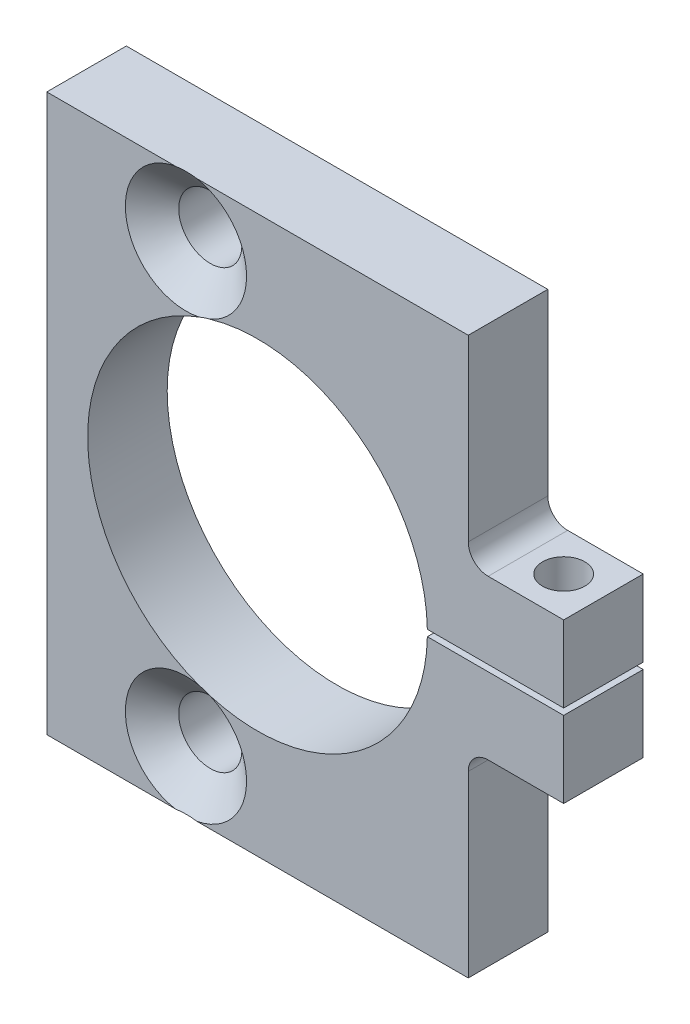
ISO-10303-21;
HEADER;
FILE_DESCRIPTION(('STEP AP214'),'2;1');
FILE_NAME('part.step','',(''),(''),'','','');
FILE_SCHEMA(('AUTOMOTIVE_DESIGN { 1 0 10303 214 1 1 1 1 }'));
ENDSEC;
DATA;
#1=APPLICATION_CONTEXT('core data for automotive mechanical design processes');
#2=APPLICATION_PROTOCOL_DEFINITION('international standard','automotive_design',2000,#1);
#3=PRODUCT_CONTEXT('',#1,'mechanical');
#4=PRODUCT('Part','Part','',(#3));
#5=PRODUCT_RELATED_PRODUCT_CATEGORY('part','',(#4));
#6=PRODUCT_DEFINITION_FORMATION('','',#4);
#7=PRODUCT_DEFINITION_CONTEXT('part definition',#1,'design');
#8=PRODUCT_DEFINITION('design','',#6,#7);
#9=PRODUCT_DEFINITION_SHAPE('','',#8);
#10=(LENGTH_UNIT() NAMED_UNIT(*) SI_UNIT(.MILLI.,.METRE.));
#11=(NAMED_UNIT(*) PLANE_ANGLE_UNIT() SI_UNIT($,.RADIAN.));
#12=(NAMED_UNIT(*) SI_UNIT($,.STERADIAN.) SOLID_ANGLE_UNIT());
#13=UNCERTAINTY_MEASURE_WITH_UNIT(LENGTH_MEASURE(1.E-05),#10,'distance_accuracy_value','');
#14=(GEOMETRIC_REPRESENTATION_CONTEXT(3) GLOBAL_UNCERTAINTY_ASSIGNED_CONTEXT((#13)) GLOBAL_UNIT_ASSIGNED_CONTEXT((#10,
#11,#12)) REPRESENTATION_CONTEXT('',''));
#15=CARTESIAN_POINT('',(0.,0.,0.));
#16=DIRECTION('',(0.,0.,1.));
#17=DIRECTION('',(1.,0.,0.));
#18=AXIS2_PLACEMENT_3D('',#15,#16,#17);
#19=CARTESIAN_POINT('',(41.275,44.45,12.7));
#20=DIRECTION('',(0.,0.,-1.));
#21=DIRECTION('',(-1.,0.,0.));
#22=AXIS2_PLACEMENT_3D('',#19,#20,#21);
#23=PLANE('',#22);
#24=DIRECTION('',(0.,1.,0.));
#25=VECTOR('',#24,1.);
#26=CARTESIAN_POINT('',(26.035,-44.45,12.7));
#27=LINE('',#26,#25);
#28=CARTESIAN_POINT('',(26.035,-44.45,12.7));
#29=VERTEX_POINT('',#28);
#30=CARTESIAN_POINT('',(26.035,-15.875,12.7));
#31=VERTEX_POINT('',#30);
#32=EDGE_CURVE('E169',#29,#31,#27,.T.);
#33=ORIENTED_EDGE('',*,*,#32,.T.);
#34=CARTESIAN_POINT('',(29.21,-15.875,12.7));
#35=DIRECTION('',(0.,0.,-1.));
#36=DIRECTION('',(-1.,0.,0.));
#37=AXIS2_PLACEMENT_3D('',#34,#35,#36);
#38=CIRCLE('',#37,3.175);
#39=CARTESIAN_POINT('',(29.21,-12.7,12.7));
#40=VERTEX_POINT('',#39);
#41=EDGE_CURVE('E347',#31,#40,#38,.T.);
#42=ORIENTED_EDGE('',*,*,#41,.T.);
#43=DIRECTION('',(1.,0.,0.));
#44=VECTOR('',#43,1.);
#45=CARTESIAN_POINT('',(41.275,-12.7,12.7));
#46=LINE('',#45,#44);
#47=CARTESIAN_POINT('',(41.275,-12.7,12.7));
#48=VERTEX_POINT('',#47);
#49=EDGE_CURVE('E346',#40,#48,#46,.T.);
#50=ORIENTED_EDGE('',*,*,#49,.T.);
#51=DIRECTION('',(0.,1.,0.));
#52=VECTOR('',#51,1.);
#53=CARTESIAN_POINT('',(41.275,-44.45,12.7));
#54=LINE('',#53,#52);
#55=CARTESIAN_POINT('',(41.275,-0.508000000000002,12.7));
#56=VERTEX_POINT('',#55);
#57=EDGE_CURVE('E176',#48,#56,#54,.T.);
#58=ORIENTED_EDGE('',*,*,#57,.T.);
#59=DIRECTION('',(1.,0.,0.));
#60=VECTOR('',#59,1.);
#61=CARTESIAN_POINT('',(16.1567832729253,-0.508000000000002,12.7));
#62=LINE('',#61,#60);
#63=CARTESIAN_POINT('',(19.5024430286064,-0.508000000000002,12.7));
#64=VERTEX_POINT('',#63);
#65=EDGE_CURVE('E329',#64,#56,#62,.T.);
#66=ORIENTED_EDGE('',*,*,#65,.F.);
#67=CARTESIAN_POINT('',(-7.62000000000001,0.,12.7));
#68=DIRECTION('',(0.,0.,1.));
#69=DIRECTION('',(1.,0.,0.));
#70=AXIS2_PLACEMENT_3D('',#67,#68,#69);
#71=CIRCLE('',#70,27.1272);
#72=CARTESIAN_POINT('',(-15.198154866507,-26.0471984800522,12.7));
#73=VERTEX_POINT('',#72);
#74=EDGE_CURVE('E322',#73,#64,#71,.T.);
#75=ORIENTED_EDGE('',*,*,#74,.F.);
#76=CARTESIAN_POINT('',(-19.05,-34.925,12.7));
#77=DIRECTION('',(0.,0.,1.));
#78=DIRECTION('',(1.,0.,0.));
#79=AXIS2_PLACEMENT_3D('',#76,#77,#78);
#80=CIRCLE('',#79,9.6774);
#81=CARTESIAN_POINT('',(-17.339314242767,-44.45,12.7));
#82=VERTEX_POINT('',#81);
#83=EDGE_CURVE('E369',#82,#73,#80,.T.);
#84=ORIENTED_EDGE('',*,*,#83,.F.);
#85=DIRECTION('',(1.,0.,0.));
#86=VECTOR('',#85,1.);
#87=CARTESIAN_POINT('',(-41.275,-44.45,12.7));
#88=LINE('',#87,#86);
#89=EDGE_CURVE('E309',#82,#29,#88,.T.);
#90=ORIENTED_EDGE('',*,*,#89,.T.);
#91=EDGE_LOOP('',(#33,#42,#50,#58,#66,#75,#84,#90));
#92=FACE_BOUND('',#91,.T.);
#93=ADVANCED_FACE('F32',(#92),#23,.F.);
#94=CARTESIAN_POINT('',(41.275,-44.45,12.7));
#95=DIRECTION('',(-1.,0.,0.));
#96=DIRECTION('',(0.,0.,1.));
#97=AXIS2_PLACEMENT_3D('',#94,#95,#96);
#98=PLANE('',#97);
#99=DIRECTION('',(0.,0.,1.));
#100=VECTOR('',#99,1.);
#101=CARTESIAN_POINT('',(41.275,-12.7,0.));
#102=LINE('',#101,#100);
#103=CARTESIAN_POINT('',(41.275,-12.7,0.));
#104=VERTEX_POINT('',#103);
#105=EDGE_CURVE('E161',#104,#48,#102,.T.);
#106=ORIENTED_EDGE('',*,*,#105,.F.);
#107=DIRECTION('',(0.,1.,0.));
#108=VECTOR('',#107,1.);
#109=CARTESIAN_POINT('',(41.275,-44.45,0.));
#110=LINE('',#109,#108);
#111=CARTESIAN_POINT('',(41.275,-0.508000000000002,0.));
#112=VERTEX_POINT('',#111);
#113=EDGE_CURVE('E174',#104,#112,#110,.T.);
#114=ORIENTED_EDGE('',*,*,#113,.T.);
#115=DIRECTION('',(0.,0.,1.));
#116=VECTOR('',#115,1.);
#117=CARTESIAN_POINT('',(41.275,-0.508000000000002,12.7));
#118=LINE('',#117,#116);
#119=EDGE_CURVE('E324',#112,#56,#118,.T.);
#120=ORIENTED_EDGE('',*,*,#119,.T.);
#121=ORIENTED_EDGE('',*,*,#57,.F.);
#122=EDGE_LOOP('',(#106,#114,#120,#121));
#123=FACE_BOUND('',#122,.T.);
#124=ADVANCED_FACE('F172',(#123),#98,.F.);
#125=CARTESIAN_POINT('',(-41.275,-44.45,12.7));
#126=DIRECTION('',(0.,1.,0.));
#127=DIRECTION('',(0.,0.,1.));
#128=AXIS2_PLACEMENT_3D('',#125,#126,#127);
#129=PLANE('',#128);
#130=DIRECTION('',(0.,0.,1.));
#131=VECTOR('',#130,1.);
#132=CARTESIAN_POINT('',(26.035,-44.45,0.));
#133=LINE('',#132,#131);
#134=CARTESIAN_POINT('',(26.035,-44.45,0.));
#135=VERTEX_POINT('',#134);
#136=EDGE_CURVE('E177',#135,#29,#133,.T.);
#137=ORIENTED_EDGE('',*,*,#136,.T.);
#138=ORIENTED_EDGE('',*,*,#89,.F.);
#139=CARTESIAN_POINT('',(-37.3789065683908,-44.45,21.9122225883036));
#140=CARTESIAN_POINT('',(-36.9777970751316,-44.45,21.6136081428321));
#141=CARTESIAN_POINT('',(-36.5757182030523,-44.45,21.3162851750371));
#142=CARTESIAN_POINT('',(-35.7691723423192,-44.45,20.7248429279077));
#143=CARTESIAN_POINT('',(-35.3647052008842,-44.45,20.4307238570317));
#144=CARTESIAN_POINT('',(-34.552036967872,-44.45,19.8456662634173));
#145=CARTESIAN_POINT('',(-34.1438293601787,-44.45,19.5547367772536));
#146=CARTESIAN_POINT('',(-33.3240650152779,-44.45,18.9776482350215));
#147=CARTESIAN_POINT('',(-32.9125083558428,-44.45,18.6914890686434));
#148=CARTESIAN_POINT('',(-32.0657165219332,-44.45,18.11163921912));
#149=CARTESIAN_POINT('',(-31.6302844161899,-44.45,17.8182354451884));
#150=CARTESIAN_POINT('',(-30.7539279555369,-44.45,17.2396598245329));
#151=CARTESIAN_POINT('',(-30.31300327215,-44.45,16.9544884735553));
#152=CARTESIAN_POINT('',(-29.4248169839805,-44.45,16.3951131409073));
#153=CARTESIAN_POINT('',(-28.9775618312723,-44.45,16.1208989481246));
#154=CARTESIAN_POINT('',(-28.0747127136943,-44.45,15.586575121114));
#155=CARTESIAN_POINT('',(-27.6191199953543,-44.45,15.3264634011319));
#156=CARTESIAN_POINT('',(-26.9291347800008,-44.45,14.9511892102019));
#157=CARTESIAN_POINT('',(-26.6986310187849,-44.45,14.8288704811586));
#158=CARTESIAN_POINT('',(-26.2347870604906,-44.45,14.5897464441861));
#159=CARTESIAN_POINT('',(-26.0014470191728,-44.45,14.4729408351964));
#160=CARTESIAN_POINT('',(-25.5315073168602,-44.45,14.2456979568016));
#161=CARTESIAN_POINT('',(-25.2949058203959,-44.45,14.1352644712514));
#162=CARTESIAN_POINT('',(-24.8183123695346,-44.45,13.9219486389381));
#163=CARTESIAN_POINT('',(-24.5783204574972,-44.45,13.8190661979319));
#164=CARTESIAN_POINT('',(-24.0974833822219,-44.45,13.6232698676627));
#165=CARTESIAN_POINT('',(-23.8566793421862,-44.45,13.5302554587116));
#166=CARTESIAN_POINT('',(-23.3713836697105,-44.45,13.354292684437));
#167=CARTESIAN_POINT('',(-23.1268918238386,-44.45,13.2713449042525));
#168=CARTESIAN_POINT('',(-22.6345450881543,-44.45,13.1172010893614));
#169=CARTESIAN_POINT('',(-22.3866948153663,-44.45,13.0459904039961));
#170=CARTESIAN_POINT('',(-21.8875875928328,-44.45,12.9168694133885));
#171=CARTESIAN_POINT('',(-21.6363315119804,-44.45,12.8589557809905));
#172=CARTESIAN_POINT('',(-21.165465772855,-44.45,12.7649389939614));
#173=CARTESIAN_POINT('',(-20.9462371463384,-44.45,12.7269346624769));
#174=CARTESIAN_POINT('',(-20.5058095935447,-44.45,12.6628834692872));
#175=CARTESIAN_POINT('',(-20.2846088856311,-44.45,12.6368488438681));
#176=CARTESIAN_POINT('',(-19.738850807055,-44.45,12.5884447246165));
#177=CARTESIAN_POINT('',(-19.4136183919624,-44.45,12.5732874636562));
#178=CARTESIAN_POINT('',(-18.7629724827444,-44.45,12.5710841611875));
#179=CARTESIAN_POINT('',(-18.4375589645166,-44.45,12.5840475836853));
#180=CARTESIAN_POINT('',(-17.7885183469015,-44.45,12.6373464678676));
#181=CARTESIAN_POINT('',(-17.4648946403033,-44.45,12.6777227701142));
#182=CARTESIAN_POINT('',(-16.8218568338894,-44.45,12.7836168356787));
#183=CARTESIAN_POINT('',(-16.5024430838655,-44.45,12.8491366746411));
#184=CARTESIAN_POINT('',(-15.6680633923492,-44.45,13.0507554836747));
#185=CARTESIAN_POINT('',(-15.1575164848272,-44.45,13.205265002259));
#186=CARTESIAN_POINT('',(-14.4036837478423,-44.45,13.4702594151555));
#187=CARTESIAN_POINT('',(-14.1542641883008,-44.45,13.5641928093957));
#188=CARTESIAN_POINT('',(-13.6592099819137,-44.45,13.7615655251344));
#189=CARTESIAN_POINT('',(-13.4135750086328,-44.45,13.8650040213603));
#190=CARTESIAN_POINT('',(-12.9228940548355,-44.45,14.0812887570081));
#191=CARTESIAN_POINT('',(-12.677892588514,-44.45,14.1942351735886));
#192=CARTESIAN_POINT('',(-12.1912632266391,-44.45,14.4271656175662));
#193=CARTESIAN_POINT('',(-11.9496353765326,-44.45,14.547149739657));
#194=CARTESIAN_POINT('',(-11.4695626594991,-44.45,14.793043474119));
#195=CARTESIAN_POINT('',(-11.2311163945184,-44.45,14.9189503659205));
#196=CARTESIAN_POINT('',(-10.7570045780567,-44.45,15.1758562240116));
#197=CARTESIAN_POINT('',(-10.5213388984705,-44.45,15.30685495451));
#198=CARTESIAN_POINT('',(-9.99314671211864,-44.45,15.6069300567459));
#199=CARTESIAN_POINT('',(-9.70132799793763,-44.45,15.777250968638));
#200=CARTESIAN_POINT('',(-9.12107412748869,-44.45,16.1235745750786));
#201=CARTESIAN_POINT('',(-8.83263913188913,-44.45,16.2995775379497));
#202=CARTESIAN_POINT('',(-8.25866696031576,-44.45,16.6563587652643));
#203=CARTESIAN_POINT('',(-7.9731303452732,-44.45,16.8371379305564));
#204=CARTESIAN_POINT('',(-7.40462675685224,-44.45,17.2026971333723));
#205=CARTESIAN_POINT('',(-7.12165983715768,-44.45,17.3874772542088));
#206=CARTESIAN_POINT('',(-6.27568135724283,-44.45,17.947162812062));
#207=CARTESIAN_POINT('',(-5.71602532175118,-44.45,18.3271415066067));
#208=CARTESIAN_POINT('',(-4.60364642423927,-44.45,19.0969492871714));
#209=CARTESIAN_POINT('',(-4.05092290644836,-44.45,19.4867774308207));
#210=CARTESIAN_POINT('',(-2.94911636600263,-44.45,20.2751460685569));
#211=CARTESIAN_POINT('',(-2.40005015089908,-44.45,20.6737100112717));
#212=CARTESIAN_POINT('',(-1.3061740270668,-44.45,21.4766481601603));
#213=CARTESIAN_POINT('',(-0.761364206019786,-44.45,21.8810224855435));
#214=CARTESIAN_POINT('',(0.324590110640036,-44.45,22.6941530540228));
#215=CARTESIAN_POINT('',(0.865736140748539,-44.45,23.1029072502087));
#216=CARTESIAN_POINT('',(1.94524232055058,-44.45,23.9240658806977));
#217=CARTESIAN_POINT('',(2.48360249017921,-44.45,24.3364702888231));
#218=CARTESIAN_POINT('',(3.97057820624369,-44.45,25.4820442771918));
#219=CARTESIAN_POINT('',(4.91677740578392,-44.45,26.2183494667041));
#220=CARTESIAN_POINT('',(6.80415094930307,-44.45,27.6976109581132));
#221=CARTESIAN_POINT('',(7.74532461824586,-44.45,28.4405681193342));
#222=CARTESIAN_POINT('',(9.61826568990615,-44.45,29.9269393962963));
#223=CARTESIAN_POINT('',(10.5500558166197,-44.45,30.6703248956648));
#224=CARTESIAN_POINT('',(11.9454719689629,-44.45,31.7880879066351));
#225=CARTESIAN_POINT('',(12.4101973791179,-44.45,32.1610946663902));
#226=CARTESIAN_POINT('',(13.3389959089699,-44.45,32.9079180281409));
#227=CARTESIAN_POINT('',(13.8030690296602,-44.45,33.281734628901));
#228=CARTESIAN_POINT('',(14.2668568821521,-44.45,33.6559049075208));
#229=B_SPLINE_CURVE_WITH_KNOTS('',3,(#139,#140,#141,#142,#143,#144,#145,#146,#147,#148,#149,
#150,#151,#152,#153,#154,#155,#156,#157,#158,#159,#160,#161,#162,#163,#164,#165,#166,#167,#168,
#169,#170,#171,#172,#173,#174,#175,#176,#177,#178,#179,#180,#181,#182,#183,#184,#185,#186,#187,
#188,#189,#190,#191,#192,#193,#194,#195,#196,#197,#198,#199,#200,#201,#202,#203,#204,#205,#206,
#207,#208,#209,#210,#211,#212,#213,#214,#215,#216,#217,#218,#219,#220,#221,#222,#223,#224,#225,
#226,#227,#228),.UNSPECIFIED.,.F.,.F.,(4,2,2,2,2,2,2,2,2,2,2,2,2,2,2,2,2,2,2,2,2,2,2,2,2,2,2,2,
2,2,2,2,2,2,2,2,2,2,2,2,2,2,2,2,4),(0.,1.50018508266125,3.0004671972828,4.50425457600885,
6.00800713250039,7.58311210459572,9.158311730562,10.7320074401641,12.3054697618331,
13.0882550462338,13.870997534725,14.6542001418307,15.437392972273,16.2116318306802,
16.9859156714355,17.7592255816378,18.532341784762,19.1995251441862,19.8673890377,
20.8428895443382,21.8187184062641,22.7960042879146,23.7733708636462,25.3704291403291,
26.1698778860053,26.9692572856691,27.7784819985516,28.5877176022014,29.3965850529847,
30.2054150915161,31.2189939035156,32.2326206498304,33.2464399626525,34.2602804068025,
36.2894954034371,38.3185169796029,40.3538887716179,42.3893023823151,44.4238029902121,
46.4582890194212,50.0550392329909,53.652260990764,57.2282365312682,59.0159533495095,
60.8036674422629),.UNSPECIFIED.);
#230=CARTESIAN_POINT('',(-20.760685757233,-44.45,12.7));
#231=VERTEX_POINT('',#230);
#232=EDGE_CURVE('E377',#82,#231,#229,.F.);
#233=ORIENTED_EDGE('',*,*,#232,.T.);
#234=CARTESIAN_POINT('',(-41.275,-44.45,12.7));
#235=VERTEX_POINT('',#234);
#236=EDGE_CURVE('E191',#235,#231,#88,.T.);
#237=ORIENTED_EDGE('',*,*,#236,.F.);
#238=DIRECTION('',(0.,0.,-1.));
#239=VECTOR('',#238,1.);
#240=CARTESIAN_POINT('',(-41.275,-44.45,12.7));
#241=LINE('',#240,#239);
#242=CARTESIAN_POINT('',(-41.275,-44.45,0.));
#243=VERTEX_POINT('',#242);
#244=EDGE_CURVE('E199',#235,#243,#241,.T.);
#245=ORIENTED_EDGE('',*,*,#244,.T.);
#246=DIRECTION('',(1.,0.,0.));
#247=VECTOR('',#246,1.);
#248=CARTESIAN_POINT('',(-41.275,-44.45,0.));
#249=LINE('',#248,#247);
#250=EDGE_CURVE('E195',#243,#135,#249,.T.);
#251=ORIENTED_EDGE('',*,*,#250,.T.);
#252=EDGE_LOOP('',(#137,#138,#233,#237,#245,#251));
#253=FACE_BOUND('',#252,.T.);
#254=ADVANCED_FACE('F284',(#253),#129,.F.);
#255=CARTESIAN_POINT('',(41.275,44.45,0.));
#256=DIRECTION('',(0.,0.,-1.));
#257=DIRECTION('',(-1.,0.,0.));
#258=AXIS2_PLACEMENT_3D('',#255,#256,#257);
#259=PLANE('',#258);
#260=CARTESIAN_POINT('',(-19.05,34.925,0.));
#261=DIRECTION('',(0.,0.,-1.));
#262=DIRECTION('',(-1.,0.,0.));
#263=AXIS2_PLACEMENT_3D('',#260,#261,#262);
#264=CIRCLE('',#263,2.92826505741483);
#265=CARTESIAN_POINT('',(-21.9782650574148,34.925,0.));
#266=VERTEX_POINT('',#265);
#267=EDGE_CURVE('E216',#266,#266,#264,.T.);
#268=ORIENTED_EDGE('',*,*,#267,.F.);
#269=EDGE_LOOP('',(#268));
#270=FACE_BOUND('',#269,.T.);
#271=CARTESIAN_POINT('',(-19.05,-34.925,0.));
#272=DIRECTION('',(0.,0.,-1.));
#273=DIRECTION('',(-1.,0.,0.));
#274=AXIS2_PLACEMENT_3D('',#271,#272,#273);
#275=CIRCLE('',#274,2.92826505741483);
#276=CARTESIAN_POINT('',(-21.9782650574148,-34.925,0.));
#277=VERTEX_POINT('',#276);
#278=EDGE_CURVE('E383',#277,#277,#275,.T.);
#279=ORIENTED_EDGE('',*,*,#278,.F.);
#280=EDGE_LOOP('',(#279));
#281=FACE_BOUND('',#280,.T.);
#282=DIRECTION('',(1.,0.,0.));
#283=VECTOR('',#282,1.);
#284=CARTESIAN_POINT('',(41.275,-12.7,0.));
#285=LINE('',#284,#283);
#286=CARTESIAN_POINT('',(29.21,-12.7,0.));
#287=VERTEX_POINT('',#286);
#288=EDGE_CURVE('E156',#287,#104,#285,.T.);
#289=ORIENTED_EDGE('',*,*,#288,.F.);
#290=CARTESIAN_POINT('',(29.21,-15.875,0.));
#291=DIRECTION('',(0.,0.,-1.));
#292=DIRECTION('',(-1.,0.,0.));
#293=AXIS2_PLACEMENT_3D('',#290,#291,#292);
#294=CIRCLE('',#293,3.175);
#295=CARTESIAN_POINT('',(26.035,-15.875,0.));
#296=VERTEX_POINT('',#295);
#297=EDGE_CURVE('E423',#287,#296,#294,.F.);
#298=ORIENTED_EDGE('',*,*,#297,.T.);
#299=DIRECTION('',(0.,1.,0.));
#300=VECTOR('',#299,1.);
#301=CARTESIAN_POINT('',(26.035,-44.45,0.));
#302=LINE('',#301,#300);
#303=EDGE_CURVE('E168',#135,#296,#302,.T.);
#304=ORIENTED_EDGE('',*,*,#303,.F.);
#305=ORIENTED_EDGE('',*,*,#250,.F.);
#306=DIRECTION('',(0.,-1.,0.));
#307=VECTOR('',#306,1.);
#308=CARTESIAN_POINT('',(-41.275,-44.45,0.));
#309=LINE('',#308,#307);
#310=CARTESIAN_POINT('',(-41.275,44.45,0.));
#311=VERTEX_POINT('',#310);
#312=EDGE_CURVE('E186',#311,#243,#309,.T.);
#313=ORIENTED_EDGE('',*,*,#312,.F.);
#314=DIRECTION('',(-1.,0.,0.));
#315=VECTOR('',#314,1.);
#316=CARTESIAN_POINT('',(-41.275,44.45,0.));
#317=LINE('',#316,#315);
#318=CARTESIAN_POINT('',(26.035,44.45,0.));
#319=VERTEX_POINT('',#318);
#320=EDGE_CURVE('E183',#319,#311,#317,.T.);
#321=ORIENTED_EDGE('',*,*,#320,.F.);
#322=DIRECTION('',(0.,-1.,0.));
#323=VECTOR('',#322,1.);
#324=CARTESIAN_POINT('',(26.035,44.45,0.));
#325=LINE('',#324,#323);
#326=CARTESIAN_POINT('',(26.035,15.875,0.));
#327=VERTEX_POINT('',#326);
#328=EDGE_CURVE('E355',#319,#327,#325,.T.);
#329=ORIENTED_EDGE('',*,*,#328,.T.);
#330=CARTESIAN_POINT('',(29.21,15.875,0.));
#331=DIRECTION('',(0.,0.,-1.));
#332=DIRECTION('',(-1.,0.,0.));
#333=AXIS2_PLACEMENT_3D('',#330,#331,#332);
#334=CIRCLE('',#333,3.175);
#335=CARTESIAN_POINT('',(29.21,12.7,0.));
#336=VERTEX_POINT('',#335);
#337=EDGE_CURVE('E11',#327,#336,#334,.F.);
#338=ORIENTED_EDGE('',*,*,#337,.T.);
#339=DIRECTION('',(1.,0.,0.));
#340=VECTOR('',#339,1.);
#341=CARTESIAN_POINT('',(41.275,12.7,0.));
#342=LINE('',#341,#340);
#343=CARTESIAN_POINT('',(41.275,12.7,0.));
#344=VERTEX_POINT('',#343);
#345=EDGE_CURVE('E357',#336,#344,#342,.T.);
#346=ORIENTED_EDGE('',*,*,#345,.T.);
#347=CARTESIAN_POINT('',(41.275,0.507999999999998,0.));
#348=VERTEX_POINT('',#347);
#349=EDGE_CURVE('E184',#348,#344,#110,.T.);
#350=ORIENTED_EDGE('',*,*,#349,.F.);
#351=DIRECTION('',(-1.,0.,0.));
#352=VECTOR('',#351,1.);
#353=CARTESIAN_POINT('',(16.1567832729253,0.507999999999998,0.));
#354=LINE('',#353,#352);
#355=CARTESIAN_POINT('',(19.5024430286064,0.507999999999998,0.));
#356=VERTEX_POINT('',#355);
#357=EDGE_CURVE('E332',#348,#356,#354,.T.);
#358=ORIENTED_EDGE('',*,*,#357,.T.);
#359=CARTESIAN_POINT('',(-7.62000000000001,0.,0.));
#360=DIRECTION('',(0.,0.,1.));
#361=DIRECTION('',(1.,0.,0.));
#362=AXIS2_PLACEMENT_3D('',#359,#360,#361);
#363=CIRCLE('',#362,27.1272);
#364=CARTESIAN_POINT('',(19.5024430286064,-0.508000000000002,0.));
#365=VERTEX_POINT('',#364);
#366=EDGE_CURVE('E189',#356,#365,#363,.T.);
#367=ORIENTED_EDGE('',*,*,#366,.T.);
#368=DIRECTION('',(1.,0.,0.));
#369=VECTOR('',#368,1.);
#370=CARTESIAN_POINT('',(16.1567832729253,-0.508000000000002,0.));
#371=LINE('',#370,#369);
#372=EDGE_CURVE('E182',#365,#112,#371,.T.);
#373=ORIENTED_EDGE('',*,*,#372,.T.);
#374=ORIENTED_EDGE('',*,*,#113,.F.);
#375=EDGE_LOOP('',(#289,#298,#304,#305,#313,#321,#329,#338,#346,#350,#358,#367,#373,#374));
#376=FACE_BOUND('',#375,.T.);
#377=ADVANCED_FACE('F180',(#270,#281,#376),#259,.T.);
#378=CARTESIAN_POINT('',(34.925,44.45,6.35));
#379=DIRECTION('',(0.,1.,0.));
#380=DIRECTION('',(0.,0.,1.));
#381=AXIS2_PLACEMENT_3D('',#378,#379,#380);
#382=CYLINDRICAL_SURFACE('',#381,3.37819999999998);
#383=CARTESIAN_POINT('',(34.925,-0.508000000000002,6.35));
#384=DIRECTION('',(0.,-1.,0.));
#385=DIRECTION('',(0.,0.,-1.));
#386=AXIS2_PLACEMENT_3D('',#383,#384,#385);
#387=CIRCLE('',#386,3.37819999999998);
#388=CARTESIAN_POINT('',(34.925,-0.508000000000002,2.97180000000002));
#389=VERTEX_POINT('',#388);
#390=EDGE_CURVE('E212',#389,#389,#387,.T.);
#391=ORIENTED_EDGE('',*,*,#390,.F.);
#392=EDGE_LOOP('',(#391));
#393=FACE_BOUND('',#392,.T.);
#394=CARTESIAN_POINT('',(34.925,-12.7,6.35));
#395=DIRECTION('',(0.,-1.,0.));
#396=DIRECTION('',(1.,0.,0.));
#397=AXIS2_PLACEMENT_3D('',#394,#395,#396);
#398=CIRCLE('',#397,3.37819999999998);
#399=CARTESIAN_POINT('',(38.3032,-12.7,6.35));
#400=VERTEX_POINT('',#399);
#401=EDGE_CURVE('E353',#400,#400,#398,.F.);
#402=ORIENTED_EDGE('',*,*,#401,.F.);
#403=EDGE_LOOP('',(#402));
#404=FACE_BOUND('',#403,.T.);
#405=ADVANCED_FACE('F288',(#393,#404),#382,.F.);
#406=CARTESIAN_POINT('',(41.275,0.507999999999998,12.7));
#407=VERTEX_POINT('',#406);
#408=CARTESIAN_POINT('',(41.275,12.7,12.7));
#409=VERTEX_POINT('',#408);
#410=EDGE_CURVE('E198',#407,#409,#54,.T.);
#411=ORIENTED_EDGE('',*,*,#410,.T.);
#412=DIRECTION('',(1.,0.,0.));
#413=VECTOR('',#412,1.);
#414=CARTESIAN_POINT('',(41.275,12.7,12.7));
#415=LINE('',#414,#413);
#416=CARTESIAN_POINT('',(29.21,12.7,12.7));
#417=VERTEX_POINT('',#416);
#418=EDGE_CURVE('E358',#417,#409,#415,.T.);
#419=ORIENTED_EDGE('',*,*,#418,.F.);
#420=CARTESIAN_POINT('',(29.21,15.875,12.7));
#421=DIRECTION('',(0.,0.,-1.));
#422=DIRECTION('',(-1.,0.,0.));
#423=AXIS2_PLACEMENT_3D('',#420,#421,#422);
#424=CIRCLE('',#423,3.175);
#425=CARTESIAN_POINT('',(26.035,15.875,12.7));
#426=VERTEX_POINT('',#425);
#427=EDGE_CURVE('E40',#417,#426,#424,.T.);
#428=ORIENTED_EDGE('',*,*,#427,.T.);
#429=DIRECTION('',(0.,-1.,0.));
#430=VECTOR('',#429,1.);
#431=CARTESIAN_POINT('',(26.035,44.45,12.7));
#432=LINE('',#431,#430);
#433=CARTESIAN_POINT('',(26.035,44.45,12.7));
#434=VERTEX_POINT('',#433);
#435=EDGE_CURVE('E361',#434,#426,#432,.T.);
#436=ORIENTED_EDGE('',*,*,#435,.F.);
#437=DIRECTION('',(-1.,0.,0.));
#438=VECTOR('',#437,1.);
#439=CARTESIAN_POINT('',(-41.275,44.45,12.7));
#440=LINE('',#439,#438);
#441=CARTESIAN_POINT('',(-17.339314242767,44.45,12.7));
#442=VERTEX_POINT('',#441);
#443=EDGE_CURVE('E313',#434,#442,#440,.T.);
#444=ORIENTED_EDGE('',*,*,#443,.T.);
#445=CARTESIAN_POINT('',(-19.05,34.925,12.7));
#446=DIRECTION('',(0.,0.,1.));
#447=DIRECTION('',(1.,0.,0.));
#448=AXIS2_PLACEMENT_3D('',#445,#446,#447);
#449=CIRCLE('',#448,9.6774);
#450=CARTESIAN_POINT('',(-15.1981548665071,26.0471984800522,12.7));
#451=VERTEX_POINT('',#450);
#452=EDGE_CURVE('E384',#451,#442,#449,.T.);
#453=ORIENTED_EDGE('',*,*,#452,.F.);
#454=CARTESIAN_POINT('',(19.5024430286064,0.507999999999998,12.7));
#455=VERTEX_POINT('',#454);
#456=EDGE_CURVE('E318',#455,#451,#71,.T.);
#457=ORIENTED_EDGE('',*,*,#456,.F.);
#458=DIRECTION('',(-1.,0.,0.));
#459=VECTOR('',#458,1.);
#460=CARTESIAN_POINT('',(16.1567832729253,0.507999999999998,12.7));
#461=LINE('',#460,#459);
#462=EDGE_CURVE('E333',#407,#455,#461,.T.);
#463=ORIENTED_EDGE('',*,*,#462,.F.);
#464=EDGE_LOOP('',(#411,#419,#428,#436,#444,#453,#457,#463));
#465=FACE_BOUND('',#464,.T.);
#466=ADVANCED_FACE('F265',(#465),#23,.F.);
#467=ORIENTED_EDGE('',*,*,#349,.T.);
#468=DIRECTION('',(0.,0.,1.));
#469=VECTOR('',#468,1.);
#470=CARTESIAN_POINT('',(41.275,12.7,0.));
#471=LINE('',#470,#469);
#472=EDGE_CURVE('E364',#344,#409,#471,.T.);
#473=ORIENTED_EDGE('',*,*,#472,.T.);
#474=ORIENTED_EDGE('',*,*,#410,.F.);
#475=DIRECTION('',(0.,0.,-1.));
#476=VECTOR('',#475,1.);
#477=CARTESIAN_POINT('',(41.275,0.508000000000002,12.7));
#478=LINE('',#477,#476);
#479=EDGE_CURVE('E326',#407,#348,#478,.T.);
#480=ORIENTED_EDGE('',*,*,#479,.T.);
#481=EDGE_LOOP('',(#467,#473,#474,#480));
#482=FACE_BOUND('',#481,.T.);
#483=ADVANCED_FACE('F261',(#482),#98,.F.);
#484=CARTESIAN_POINT('',(-41.275,44.45,12.7));
#485=DIRECTION('',(0.,-1.,0.));
#486=DIRECTION('',(0.,0.,-1.));
#487=AXIS2_PLACEMENT_3D('',#484,#485,#486);
#488=PLANE('',#487);
#489=ORIENTED_EDGE('',*,*,#443,.F.);
#490=DIRECTION('',(0.,0.,1.));
#491=VECTOR('',#490,1.);
#492=CARTESIAN_POINT('',(26.035,44.45,0.));
#493=LINE('',#492,#491);
#494=EDGE_CURVE('E360',#319,#434,#493,.T.);
#495=ORIENTED_EDGE('',*,*,#494,.F.);
#496=ORIENTED_EDGE('',*,*,#320,.T.);
#497=DIRECTION('',(0.,0.,-1.));
#498=VECTOR('',#497,1.);
#499=CARTESIAN_POINT('',(-41.275,44.45,12.7));
#500=LINE('',#499,#498);
#501=CARTESIAN_POINT('',(-41.275,44.45,12.7));
#502=VERTEX_POINT('',#501);
#503=EDGE_CURVE('E202',#502,#311,#500,.T.);
#504=ORIENTED_EDGE('',*,*,#503,.F.);
#505=CARTESIAN_POINT('',(-20.760685757233,44.45,12.7));
#506=VERTEX_POINT('',#505);
#507=EDGE_CURVE('E314',#506,#502,#440,.T.);
#508=ORIENTED_EDGE('',*,*,#507,.F.);
#509=CARTESIAN_POINT('',(-37.3789065683908,44.45,21.9122225883036));
#510=CARTESIAN_POINT('',(-36.9777970751316,44.45,21.6136081428321));
#511=CARTESIAN_POINT('',(-36.5757182030523,44.45,21.3162851750371));
#512=CARTESIAN_POINT('',(-35.7691723423192,44.45,20.7248429279077));
#513=CARTESIAN_POINT('',(-35.3647052008842,44.45,20.4307238570317));
#514=CARTESIAN_POINT('',(-34.552036967872,44.45,19.8456662634173));
#515=CARTESIAN_POINT('',(-34.1438293601787,44.45,19.5547367772536));
#516=CARTESIAN_POINT('',(-33.3240650152779,44.45,18.9776482350215));
#517=CARTESIAN_POINT('',(-32.9125083558428,44.45,18.6914890686434));
#518=CARTESIAN_POINT('',(-32.0657165219332,44.45,18.11163921912));
#519=CARTESIAN_POINT('',(-31.6302844161899,44.45,17.8182354451884));
#520=CARTESIAN_POINT('',(-30.7539279555369,44.45,17.2396598245329));
#521=CARTESIAN_POINT('',(-30.31300327215,44.45,16.9544884735553));
#522=CARTESIAN_POINT('',(-29.4248169839805,44.45,16.3951131409073));
#523=CARTESIAN_POINT('',(-28.9775618312723,44.45,16.1208989481246));
#524=CARTESIAN_POINT('',(-28.0747127136943,44.45,15.586575121114));
#525=CARTESIAN_POINT('',(-27.6191199953543,44.45,15.3264634011319));
#526=CARTESIAN_POINT('',(-26.9291347800008,44.45,14.9511892102019));
#527=CARTESIAN_POINT('',(-26.6986310187849,44.45,14.8288704811586));
#528=CARTESIAN_POINT('',(-26.2347870604906,44.45,14.5897464441861));
#529=CARTESIAN_POINT('',(-26.0014470191728,44.45,14.4729408351964));
#530=CARTESIAN_POINT('',(-25.5315073168602,44.45,14.2456979568016));
#531=CARTESIAN_POINT('',(-25.2949058203959,44.45,14.1352644712514));
#532=CARTESIAN_POINT('',(-24.8183123695346,44.45,13.9219486389381));
#533=CARTESIAN_POINT('',(-24.5783204574972,44.45,13.8190661979319));
#534=CARTESIAN_POINT('',(-24.0974833822219,44.45,13.6232698676627));
#535=CARTESIAN_POINT('',(-23.8566793421862,44.45,13.5302554587116));
#536=CARTESIAN_POINT('',(-23.3713836697105,44.45,13.354292684437));
#537=CARTESIAN_POINT('',(-23.1268918238386,44.45,13.2713449042525));
#538=CARTESIAN_POINT('',(-22.6345450881543,44.45,13.1172010893614));
#539=CARTESIAN_POINT('',(-22.3866948153663,44.45,13.0459904039961));
#540=CARTESIAN_POINT('',(-21.8875875928328,44.45,12.9168694133885));
#541=CARTESIAN_POINT('',(-21.6363315119804,44.45,12.8589557809905));
#542=CARTESIAN_POINT('',(-21.165465772855,44.45,12.7649389939614));
#543=CARTESIAN_POINT('',(-20.9462371463384,44.45,12.7269346624769));
#544=CARTESIAN_POINT('',(-20.5058095935447,44.45,12.6628834692872));
#545=CARTESIAN_POINT('',(-20.2846088856311,44.45,12.6368488438681));
#546=CARTESIAN_POINT('',(-19.738850807055,44.45,12.5884447246165));
#547=CARTESIAN_POINT('',(-19.4136183919624,44.45,12.5732874636562));
#548=CARTESIAN_POINT('',(-18.7629724827444,44.45,12.5710841611875));
#549=CARTESIAN_POINT('',(-18.4375589645166,44.45,12.5840475836853));
#550=CARTESIAN_POINT('',(-17.7885183469015,44.45,12.6373464678676));
#551=CARTESIAN_POINT('',(-17.4648946403033,44.45,12.6777227701142));
#552=CARTESIAN_POINT('',(-16.8218568338894,44.45,12.7836168356787));
#553=CARTESIAN_POINT('',(-16.5024430838655,44.45,12.8491366746411));
#554=CARTESIAN_POINT('',(-15.6680633923492,44.45,13.0507554836747));
#555=CARTESIAN_POINT('',(-15.1575164848272,44.45,13.205265002259));
#556=CARTESIAN_POINT('',(-14.4036837478423,44.45,13.4702594151555));
#557=CARTESIAN_POINT('',(-14.1542641883008,44.45,13.5641928093957));
#558=CARTESIAN_POINT('',(-13.6592099819137,44.45,13.7615655251344));
#559=CARTESIAN_POINT('',(-13.4135750086328,44.45,13.8650040213603));
#560=CARTESIAN_POINT('',(-12.9228940548355,44.45,14.0812887570081));
#561=CARTESIAN_POINT('',(-12.677892588514,44.45,14.1942351735886));
#562=CARTESIAN_POINT('',(-12.1912632266391,44.45,14.4271656175662));
#563=CARTESIAN_POINT('',(-11.9496353765326,44.45,14.547149739657));
#564=CARTESIAN_POINT('',(-11.4695626594991,44.45,14.793043474119));
#565=CARTESIAN_POINT('',(-11.2311163945184,44.45,14.9189503659205));
#566=CARTESIAN_POINT('',(-10.7570045780567,44.45,15.1758562240116));
#567=CARTESIAN_POINT('',(-10.5213388984705,44.45,15.30685495451));
#568=CARTESIAN_POINT('',(-9.99314671211864,44.45,15.6069300567459));
#569=CARTESIAN_POINT('',(-9.70132799793763,44.45,15.777250968638));
#570=CARTESIAN_POINT('',(-9.12107412748869,44.45,16.1235745750786));
#571=CARTESIAN_POINT('',(-8.83263913188913,44.45,16.2995775379497));
#572=CARTESIAN_POINT('',(-8.25866696031576,44.45,16.6563587652643));
#573=CARTESIAN_POINT('',(-7.9731303452732,44.45,16.8371379305564));
#574=CARTESIAN_POINT('',(-7.40462675685224,44.45,17.2026971333723));
#575=CARTESIAN_POINT('',(-7.12165983715768,44.45,17.3874772542088));
#576=CARTESIAN_POINT('',(-6.27568135724283,44.45,17.947162812062));
#577=CARTESIAN_POINT('',(-5.71602532175118,44.45,18.3271415066067));
#578=CARTESIAN_POINT('',(-4.60364642423927,44.45,19.0969492871714));
#579=CARTESIAN_POINT('',(-4.05092290644836,44.45,19.4867774308207));
#580=CARTESIAN_POINT('',(-2.94911636600263,44.45,20.2751460685569));
#581=CARTESIAN_POINT('',(-2.40005015089908,44.45,20.6737100112717));
#582=CARTESIAN_POINT('',(-1.3061740270668,44.45,21.4766481601603));
#583=CARTESIAN_POINT('',(-0.761364206019786,44.45,21.8810224855435));
#584=CARTESIAN_POINT('',(0.324590110640036,44.45,22.6941530540228));
#585=CARTESIAN_POINT('',(0.865736140748539,44.45,23.1029072502087));
#586=CARTESIAN_POINT('',(1.94524232055058,44.45,23.9240658806977));
#587=CARTESIAN_POINT('',(2.48360249017921,44.45,24.3364702888231));
#588=CARTESIAN_POINT('',(3.97057820624369,44.45,25.4820442771918));
#589=CARTESIAN_POINT('',(4.91677740578392,44.45,26.2183494667041));
#590=CARTESIAN_POINT('',(6.80415094930307,44.45,27.6976109581132));
#591=CARTESIAN_POINT('',(7.74532461824586,44.45,28.4405681193342));
#592=CARTESIAN_POINT('',(9.61826568990615,44.45,29.9269393962963));
#593=CARTESIAN_POINT('',(10.5500558166197,44.45,30.6703248956648));
#594=CARTESIAN_POINT('',(11.9454719689629,44.45,31.7880879066351));
#595=CARTESIAN_POINT('',(12.4101973791179,44.45,32.1610946663902));
#596=CARTESIAN_POINT('',(13.3389959089699,44.45,32.9079180281409));
#597=CARTESIAN_POINT('',(13.8030690296602,44.45,33.281734628901));
#598=CARTESIAN_POINT('',(14.2668568821521,44.45,33.6559049075208));
#599=B_SPLINE_CURVE_WITH_KNOTS('',3,(#509,#510,#511,#512,#513,#514,#515,#516,#517,#518,#519,
#520,#521,#522,#523,#524,#525,#526,#527,#528,#529,#530,#531,#532,#533,#534,#535,#536,#537,#538,
#539,#540,#541,#542,#543,#544,#545,#546,#547,#548,#549,#550,#551,#552,#553,#554,#555,#556,#557,
#558,#559,#560,#561,#562,#563,#564,#565,#566,#567,#568,#569,#570,#571,#572,#573,#574,#575,#576,
#577,#578,#579,#580,#581,#582,#583,#584,#585,#586,#587,#588,#589,#590,#591,#592,#593,#594,#595,
#596,#597,#598),.UNSPECIFIED.,.F.,.F.,(4,2,2,2,2,2,2,2,2,2,2,2,2,2,2,2,2,2,2,2,2,2,2,2,2,2,2,2,
2,2,2,2,2,2,2,2,2,2,2,2,2,2,2,2,4),(0.,1.50018508266125,3.0004671972828,4.50425457600885,
6.00800713250039,7.58311210459572,9.158311730562,10.7320074401641,12.3054697618331,
13.0882550462338,13.870997534725,14.6542001418307,15.437392972273,16.2116318306802,
16.9859156714355,17.7592255816378,18.532341784762,19.1995251441862,19.8673890377,
20.8428895443382,21.8187184062641,22.7960042879146,23.7733708636462,25.3704291403291,
26.1698778860053,26.9692572856691,27.7784819985516,28.5877176022014,29.3965850529847,
30.2054150915161,31.2189939035156,32.2326206498304,33.2464399626525,34.2602804068025,
36.2894954034371,38.3185169796029,40.3538887716179,42.3893023823151,44.4238029902121,
46.4582890194212,50.0550392329909,53.652260990764,57.2282365312682,59.0159533495095,
60.8036674422629),.UNSPECIFIED.);
#600=EDGE_CURVE('E244',#506,#442,#599,.T.);
#601=ORIENTED_EDGE('',*,*,#600,.T.);
#602=EDGE_LOOP('',(#489,#495,#496,#504,#508,#601));
#603=FACE_BOUND('',#602,.T.);
#604=ADVANCED_FACE('F255',(#603),#488,.F.);
#605=CARTESIAN_POINT('',(-41.275,-44.45,12.7));
#606=DIRECTION('',(1.,0.,0.));
#607=DIRECTION('',(0.,0.,-1.));
#608=AXIS2_PLACEMENT_3D('',#605,#606,#607);
#609=PLANE('',#608);
#610=ORIENTED_EDGE('',*,*,#312,.T.);
#611=ORIENTED_EDGE('',*,*,#244,.F.);
#612=DIRECTION('',(0.,-1.,0.));
#613=VECTOR('',#612,1.);
#614=CARTESIAN_POINT('',(-41.275,-44.45,12.7));
#615=LINE('',#614,#613);
#616=EDGE_CURVE('E305',#502,#235,#615,.T.);
#617=ORIENTED_EDGE('',*,*,#616,.F.);
#618=ORIENTED_EDGE('',*,*,#503,.T.);
#619=EDGE_LOOP('',(#610,#611,#617,#618));
#620=FACE_BOUND('',#619,.T.);
#621=ADVANCED_FACE('F260',(#620),#609,.F.);
#622=ORIENTED_EDGE('',*,*,#236,.T.);
#623=CARTESIAN_POINT('',(-16.9078043284765,-25.4876768379531,12.7));
#624=VERTEX_POINT('',#623);
#625=EDGE_CURVE('E302',#624,#231,#80,.T.);
#626=ORIENTED_EDGE('',*,*,#625,.F.);
#627=CARTESIAN_POINT('',(-16.9078043284766,25.4876768379531,12.7));
#628=VERTEX_POINT('',#627);
#629=EDGE_CURVE('E321',#628,#624,#71,.T.);
#630=ORIENTED_EDGE('',*,*,#629,.F.);
#631=EDGE_CURVE('E405',#506,#628,#449,.T.);
#632=ORIENTED_EDGE('',*,*,#631,.F.);
#633=ORIENTED_EDGE('',*,*,#507,.T.);
#634=ORIENTED_EDGE('',*,*,#616,.T.);
#635=EDGE_LOOP('',(#622,#626,#630,#632,#633,#634));
#636=FACE_BOUND('',#635,.T.);
#637=ADVANCED_FACE('F280',(#636),#23,.F.);
#638=CARTESIAN_POINT('',(-7.62000000000001,0.,0.));
#639=DIRECTION('',(0.,0.,1.));
#640=DIRECTION('',(1.,0.,0.));
#641=AXIS2_PLACEMENT_3D('',#638,#639,#640);
#642=CYLINDRICAL_SURFACE('',#641,27.1272);
#643=ORIENTED_EDGE('',*,*,#629,.T.);
#644=CARTESIAN_POINT('',(-19.1375326795694,-24.5607699556641,13.2766289921739));
#645=CARTESIAN_POINT('',(-18.9614040049407,-24.6433675725058,13.2060685615843));
#646=CARTESIAN_POINT('',(-18.7827682884731,-24.7248218832202,13.140199723214));
#647=CARTESIAN_POINT('',(-18.420520147925,-24.8851960607864,13.0192158685378));
#648=CARTESIAN_POINT('',(-18.2369021422417,-24.96411284881,12.9641135324819));
#649=CARTESIAN_POINT('',(-17.8648503925541,-25.1190899300615,12.8661289395033));
#650=CARTESIAN_POINT('',(-17.6764095829065,-25.1951455751464,12.8232658798385));
#651=CARTESIAN_POINT('',(-17.2957004854439,-25.3437874527428,12.7512209313879));
#652=CARTESIAN_POINT('',(-17.1034342266687,-25.4163754584985,12.7220319813495));
#653=CARTESIAN_POINT('',(-16.6280429552848,-25.5896418008958,12.6684928061795));
#654=CARTESIAN_POINT('',(-16.3431577647644,-25.6881746366399,12.6523033433621));
#655=CARTESIAN_POINT('',(-15.7708701903816,-25.8754472323633,12.6523685873707));
#656=CARTESIAN_POINT('',(-15.4834743800045,-25.9642072015973,12.6685549624417));
#657=CARTESIAN_POINT('',(-14.9756965254364,-26.1119053398834,12.7245168876293));
#658=CARTESIAN_POINT('',(-14.7552078342114,-26.1729895808692,12.7579617968788));
#659=CARTESIAN_POINT('',(-14.3157343206264,-26.2888533003665,12.8416171835854));
#660=CARTESIAN_POINT('',(-14.0967500106777,-26.3436307219732,12.8918331100278));
#661=CARTESIAN_POINT('',(-13.44129122006,-26.4990507216548,13.0654401413702));
#662=CARTESIAN_POINT('',(-13.0084528713237,-26.5901630617725,13.2115235509035));
#663=CARTESIAN_POINT('',(-12.3539962907638,-26.7119552135521,13.4697145210497));
#664=CARTESIAN_POINT('',(-12.1273745517642,-26.7510830838612,13.5662348569354));
#665=CARTESIAN_POINT('',(-11.6777915189124,-26.8229577336228,13.7698690712972));
#666=CARTESIAN_POINT('',(-11.4548311741721,-26.8557028817213,13.8769856475381));
#667=CARTESIAN_POINT('',(-11.0152592526237,-26.9147882616264,14.0985454566909));
#668=CARTESIAN_POINT('',(-10.7986033118079,-26.9412023577563,14.2128822986845));
#669=CARTESIAN_POINT('',(-10.3687416183865,-26.9884416404453,14.4485404684001));
#670=CARTESIAN_POINT('',(-10.1555330332832,-27.0092716600228,14.5698556451819));
#671=CARTESIAN_POINT('',(-9.94381623339228,-27.027483381799,14.6940105053079));
#672=B_SPLINE_CURVE_WITH_KNOTS('',3,(#644,#645,#646,#647,#648,#649,#650,#651,#652,#653,#654,
#655,#656,#657,#658,#659,#660,#661,#662,#663,#664,#665,#666,#667,#668,#669,#670,#671),
.UNSPECIFIED.,.F.,.F.,(4,2,2,2,2,2,2,2,2,2,2,2,2,4),(0.,0.620851584921604,1.24243002781361,
1.86497812493036,2.4872043854934,3.39088089236297,4.29265213135583,4.98559711034253,
5.67876744991321,7.07177866201897,7.81979421511835,8.56800070284212,9.30699919076406,
10.0453559952472),.UNSPECIFIED.);
#673=EDGE_CURVE('E224',#624,#73,#672,.T.);
#674=ORIENTED_EDGE('',*,*,#673,.T.);
#675=ORIENTED_EDGE('',*,*,#74,.T.);
#676=DIRECTION('',(0.,0.,1.));
#677=VECTOR('',#676,1.);
#678=CARTESIAN_POINT('',(19.5024430286064,-0.508000000000002,0.));
#679=LINE('',#678,#677);
#680=EDGE_CURVE('E208',#64,#365,#679,.F.);
#681=ORIENTED_EDGE('',*,*,#680,.T.);
#682=ORIENTED_EDGE('',*,*,#366,.F.);
#683=DIRECTION('',(0.,0.,1.));
#684=VECTOR('',#683,1.);
#685=CARTESIAN_POINT('',(19.5024430286064,0.507999999999998,0.));
#686=LINE('',#685,#684);
#687=EDGE_CURVE('E205',#356,#455,#686,.T.);
#688=ORIENTED_EDGE('',*,*,#687,.T.);
#689=ORIENTED_EDGE('',*,*,#456,.T.);
#690=CARTESIAN_POINT('',(-9.94381623339228,27.027483381799,14.6940105053079));
#691=CARTESIAN_POINT('',(-10.0961629662498,27.0143826121025,14.6046494317821));
#692=CARTESIAN_POINT('',(-10.2492824746053,26.9999217494765,14.5167825108517));
#693=CARTESIAN_POINT('',(-10.557207693845,26.9681623983447,14.3444985600562));
#694=CARTESIAN_POINT('',(-10.7120138172084,26.9508632004592,14.2600823992379));
#695=CARTESIAN_POINT('',(-11.0240375585776,26.9132364973995,14.0948568587394));
#696=CARTESIAN_POINT('',(-11.181262623332,26.8928964499377,14.0140643093085));
#697=CARTESIAN_POINT('',(-11.4975429629889,26.8491177550589,13.8570721288566));
#698=CARTESIAN_POINT('',(-11.6565981151002,26.825679314437,13.780872191806));
#699=CARTESIAN_POINT('',(-12.1388554273719,26.7501653574983,13.5591018670804));
#700=CARTESIAN_POINT('',(-12.4650386985441,26.6931421030249,13.4214974992479));
#701=CARTESIAN_POINT('',(-13.1246129251749,26.5649524155095,13.1742205748302));
#702=CARTESIAN_POINT('',(-13.4579884376502,26.4938140285422,13.0644935976908));
#703=CARTESIAN_POINT('',(-14.0261476255052,26.361011450773,12.9087941181541));
#704=CARTESIAN_POINT('',(-14.2593287293321,26.3032878241387,12.8536077161326));
#705=CARTESIAN_POINT('',(-14.7270940227512,26.1807648155941,12.762270173661));
#706=CARTESIAN_POINT('',(-14.9616741089931,26.1159809402763,12.7260782934802));
#707=CARTESIAN_POINT('',(-15.3399399369859,26.0059591997566,12.6843640236809));
#708=CARTESIAN_POINT('',(-15.4835726378949,25.962892134243,12.6723901885258));
#709=CARTESIAN_POINT('',(-15.7705242133425,25.8742434096685,12.6563839655743));
#710=CARTESIAN_POINT('',(-15.913843071738,25.8286616242777,12.65235197712));
#711=CARTESIAN_POINT('',(-16.1999751504994,25.7350288764358,12.6523199780386));
#712=CARTESIAN_POINT('',(-16.3427868810119,25.6869733614342,12.656335332698));
#713=CARTESIAN_POINT('',(-16.6271940931025,25.5886318911478,12.6723421435116));
#714=CARTESIAN_POINT('',(-16.7687894844861,25.5383457721333,12.6843341860736));
#715=CARTESIAN_POINT('',(-17.1033789655515,25.4163928431072,12.72203907511));
#716=CARTESIAN_POINT('',(-17.2956539577333,25.3438041472039,12.7512178408583));
#717=CARTESIAN_POINT('',(-17.6763497107112,25.1951704232107,12.8232488339292));
#718=CARTESIAN_POINT('',(-17.8647683767638,25.1191235853279,12.8661082932359));
#719=CARTESIAN_POINT('',(-18.2368181526123,24.9641483417716,12.9640904600193));
#720=CARTESIAN_POINT('',(-18.4204555131191,24.8852240594469,13.0191961547356));
#721=CARTESIAN_POINT('',(-18.7827396287554,24.7248351874512,13.140188279522));
#722=CARTESIAN_POINT('',(-18.961392014594,24.6433737037363,13.2060619176008));
#723=CARTESIAN_POINT('',(-19.1375326795694,24.5607699556641,13.2766289921739));
#724=B_SPLINE_CURVE_WITH_KNOTS('',3,(#690,#691,#692,#693,#694,#695,#696,#697,#698,#699,#700,
#701,#702,#703,#704,#705,#706,#707,#708,#709,#710,#711,#712,#713,#714,#715,#716,#717,#718,#719,
#720,#721,#722,#723),.UNSPECIFIED.,.F.,.F.,(4,2,2,2,2,2,2,2,2,2,2,2,2,2,2,2,4),(0.,
0.531321186794358,1.06277536848514,1.59648536201226,2.13015975225288,3.20472410522994,
4.27717435524448,5.01589332221412,5.75302133114239,6.20409982681174,6.65520100359821,
7.10716431614358,7.55916085853092,8.18132789543282,8.80382437283556,9.42546141011635,
10.0463652578647),.UNSPECIFIED.);
#725=EDGE_CURVE('E211',#451,#628,#724,.T.);
#726=ORIENTED_EDGE('',*,*,#725,.T.);
#727=EDGE_LOOP('',(#643,#674,#675,#681,#682,#688,#689,#726));
#728=FACE_BOUND('',#727,.T.);
#729=ADVANCED_FACE('F226',(#728),#642,.F.);
#730=CARTESIAN_POINT('',(16.1567832729253,0.507999999999998,0.));
#731=DIRECTION('',(0.,1.,0.));
#732=DIRECTION('',(0.,0.,1.));
#733=AXIS2_PLACEMENT_3D('',#730,#731,#732);
#734=PLANE('',#733);
#735=CARTESIAN_POINT('',(34.925,0.508000000000002,6.35));
#736=DIRECTION('',(0.,1.,0.));
#737=DIRECTION('',(0.,0.,1.));
#738=AXIS2_PLACEMENT_3D('',#735,#736,#737);
#739=CIRCLE('',#738,3.37819999999998);
#740=CARTESIAN_POINT('',(34.925,0.508000000000002,9.72819999999999));
#741=VERTEX_POINT('',#740);
#742=EDGE_CURVE('E215',#741,#741,#739,.T.);
#743=ORIENTED_EDGE('',*,*,#742,.T.);
#744=EDGE_LOOP('',(#743));
#745=FACE_BOUND('',#744,.T.);
#746=ORIENTED_EDGE('',*,*,#462,.T.);
#747=ORIENTED_EDGE('',*,*,#687,.F.);
#748=ORIENTED_EDGE('',*,*,#357,.F.);
#749=ORIENTED_EDGE('',*,*,#479,.F.);
#750=EDGE_LOOP('',(#746,#747,#748,#749));
#751=FACE_BOUND('',#750,.T.);
#752=ADVANCED_FACE('F295',(#745,#751),#734,.F.);
#753=CARTESIAN_POINT('',(16.1567832729253,-0.508000000000002,0.));
#754=DIRECTION('',(0.,-1.,0.));
#755=DIRECTION('',(0.,0.,-1.));
#756=AXIS2_PLACEMENT_3D('',#753,#754,#755);
#757=PLANE('',#756);
#758=ORIENTED_EDGE('',*,*,#390,.T.);
#759=EDGE_LOOP('',(#758));
#760=FACE_BOUND('',#759,.T.);
#761=ORIENTED_EDGE('',*,*,#372,.F.);
#762=ORIENTED_EDGE('',*,*,#680,.F.);
#763=ORIENTED_EDGE('',*,*,#65,.T.);
#764=ORIENTED_EDGE('',*,*,#119,.F.);
#765=EDGE_LOOP('',(#761,#762,#763,#764));
#766=FACE_BOUND('',#765,.T.);
#767=ADVANCED_FACE('F345',(#760,#766),#757,.F.);
#768=CARTESIAN_POINT('',(34.925,12.7,6.35));
#769=DIRECTION('',(0.,-1.,0.));
#770=DIRECTION('',(1.,0.,0.));
#771=AXIS2_PLACEMENT_3D('',#768,#769,#770);
#772=CIRCLE('',#771,3.37819999999998);
#773=CARTESIAN_POINT('',(38.3032,12.7,6.35));
#774=VERTEX_POINT('',#773);
#775=EDGE_CURVE('E367',#774,#774,#772,.F.);
#776=ORIENTED_EDGE('',*,*,#775,.T.);
#777=EDGE_LOOP('',(#776));
#778=FACE_BOUND('',#777,.T.);
#779=ORIENTED_EDGE('',*,*,#742,.F.);
#780=EDGE_LOOP('',(#779));
#781=FACE_BOUND('',#780,.T.);
#782=ADVANCED_FACE('F236',(#778,#781),#382,.F.);
#783=CARTESIAN_POINT('',(-19.05,34.925,12.7));
#784=DIRECTION('',(0.,0.,1.));
#785=DIRECTION('',(1.,0.,0.));
#786=AXIS2_PLACEMENT_3D('',#783,#784,#785);
#787=CONICAL_SURFACE('',#786,9.6774,0.872664625997165);
#788=CARTESIAN_POINT('',(-19.05,34.925,8.81035365967772));
#789=DIRECTION('',(0.,0.,1.));
#790=DIRECTION('',(1.,0.,0.));
#791=AXIS2_PLACEMENT_3D('',#788,#789,#790);
#792=CIRCLE('',#791,5.0419);
#793=CARTESIAN_POINT('',(-14.0081,34.925,8.81035365967772));
#794=VERTEX_POINT('',#793);
#795=EDGE_CURVE('E439',#794,#794,#792,.T.);
#796=ORIENTED_EDGE('',*,*,#795,.F.);
#797=EDGE_LOOP('',(#796));
#798=FACE_BOUND('',#797,.T.);
#799=ORIENTED_EDGE('',*,*,#631,.T.);
#800=ORIENTED_EDGE('',*,*,#725,.F.);
#801=ORIENTED_EDGE('',*,*,#452,.T.);
#802=ORIENTED_EDGE('',*,*,#600,.F.);
#803=EDGE_LOOP('',(#799,#800,#801,#802));
#804=FACE_BOUND('',#803,.T.);
#805=ADVANCED_FACE('F230',(#798,#804),#787,.F.);
#806=CARTESIAN_POINT('',(-19.05,34.925,1.27));
#807=DIRECTION('',(0.,0.,1.));
#808=DIRECTION('',(1.,0.,0.));
#809=AXIS2_PLACEMENT_3D('',#806,#807,#808);
#810=CONICAL_SURFACE('',#809,5.04189999999999,1.02974425867665);
#811=ORIENTED_EDGE('',*,*,#267,.T.);
#812=EDGE_LOOP('',(#811));
#813=FACE_BOUND('',#812,.T.);
#814=CARTESIAN_POINT('',(-19.05,34.925,1.27));
#815=DIRECTION('',(0.,0.,1.));
#816=DIRECTION('',(1.,0.,0.));
#817=AXIS2_PLACEMENT_3D('',#814,#815,#816);
#818=CIRCLE('',#817,5.04189999999999);
#819=CARTESIAN_POINT('',(-14.0081,34.925,1.27));
#820=VERTEX_POINT('',#819);
#821=EDGE_CURVE('E252',#820,#820,#818,.T.);
#822=ORIENTED_EDGE('',*,*,#821,.T.);
#823=EDGE_LOOP('',(#822));
#824=FACE_BOUND('',#823,.T.);
#825=ADVANCED_FACE('F235',(#813,#824),#810,.F.);
#826=CARTESIAN_POINT('',(-19.05,34.925,12.7));
#827=DIRECTION('',(0.,0.,1.));
#828=DIRECTION('',(1.,0.,0.));
#829=AXIS2_PLACEMENT_3D('',#826,#827,#828);
#830=CYLINDRICAL_SURFACE('',#829,5.04189999999999);
#831=ORIENTED_EDGE('',*,*,#821,.F.);
#832=EDGE_LOOP('',(#831));
#833=FACE_BOUND('',#832,.T.);
#834=ORIENTED_EDGE('',*,*,#795,.T.);
#835=EDGE_LOOP('',(#834));
#836=FACE_BOUND('',#835,.T.);
#837=ADVANCED_FACE('F240',(#833,#836),#830,.F.);
#838=CARTESIAN_POINT('',(-19.05,-34.925,12.7));
#839=DIRECTION('',(0.,0.,1.));
#840=DIRECTION('',(1.,0.,0.));
#841=AXIS2_PLACEMENT_3D('',#838,#839,#840);
#842=CONICAL_SURFACE('',#841,9.6774,0.872664625997165);
#843=CARTESIAN_POINT('',(-19.05,-34.925,8.81035365967772));
#844=DIRECTION('',(0.,0.,1.));
#845=DIRECTION('',(1.,0.,0.));
#846=AXIS2_PLACEMENT_3D('',#843,#844,#845);
#847=CIRCLE('',#846,5.0419);
#848=CARTESIAN_POINT('',(-14.0081,-34.925,8.81035365967772));
#849=VERTEX_POINT('',#848);
#850=EDGE_CURVE('E371',#849,#849,#847,.T.);
#851=ORIENTED_EDGE('',*,*,#850,.F.);
#852=EDGE_LOOP('',(#851));
#853=FACE_BOUND('',#852,.T.);
#854=ORIENTED_EDGE('',*,*,#83,.T.);
#855=ORIENTED_EDGE('',*,*,#673,.F.);
#856=ORIENTED_EDGE('',*,*,#625,.T.);
#857=ORIENTED_EDGE('',*,*,#232,.F.);
#858=EDGE_LOOP('',(#854,#855,#856,#857));
#859=FACE_BOUND('',#858,.T.);
#860=ADVANCED_FACE('F385',(#853,#859),#842,.F.);
#861=CARTESIAN_POINT('',(-19.05,-34.925,1.27));
#862=DIRECTION('',(0.,0.,1.));
#863=DIRECTION('',(1.,0.,0.));
#864=AXIS2_PLACEMENT_3D('',#861,#862,#863);
#865=CONICAL_SURFACE('',#864,5.04189999999999,1.02974425867665);
#866=ORIENTED_EDGE('',*,*,#278,.T.);
#867=EDGE_LOOP('',(#866));
#868=FACE_BOUND('',#867,.T.);
#869=CARTESIAN_POINT('',(-19.05,-34.925,1.27));
#870=DIRECTION('',(0.,0.,1.));
#871=DIRECTION('',(1.,0.,0.));
#872=AXIS2_PLACEMENT_3D('',#869,#870,#871);
#873=CIRCLE('',#872,5.04189999999999);
#874=CARTESIAN_POINT('',(-14.0081,-34.925,1.27));
#875=VERTEX_POINT('',#874);
#876=EDGE_CURVE('E374',#875,#875,#873,.T.);
#877=ORIENTED_EDGE('',*,*,#876,.T.);
#878=EDGE_LOOP('',(#877));
#879=FACE_BOUND('',#878,.T.);
#880=ADVANCED_FACE('F238',(#868,#879),#865,.F.);
#881=CARTESIAN_POINT('',(-19.05,-34.925,12.7));
#882=DIRECTION('',(0.,0.,1.));
#883=DIRECTION('',(1.,0.,0.));
#884=AXIS2_PLACEMENT_3D('',#881,#882,#883);
#885=CYLINDRICAL_SURFACE('',#884,5.04189999999999);
#886=ORIENTED_EDGE('',*,*,#876,.F.);
#887=EDGE_LOOP('',(#886));
#888=FACE_BOUND('',#887,.T.);
#889=ORIENTED_EDGE('',*,*,#850,.T.);
#890=EDGE_LOOP('',(#889));
#891=FACE_BOUND('',#890,.T.);
#892=ADVANCED_FACE('F477',(#888,#891),#885,.F.);
#893=CARTESIAN_POINT('',(41.275,12.7,0.));
#894=DIRECTION('',(0.,-1.,0.));
#895=DIRECTION('',(1.,0.,0.));
#896=AXIS2_PLACEMENT_3D('',#893,#894,#895);
#897=PLANE('',#896);
#898=ORIENTED_EDGE('',*,*,#345,.F.);
#899=DIRECTION('',(0.,0.,1.));
#900=VECTOR('',#899,1.);
#901=CARTESIAN_POINT('',(29.21,12.7,12.7));
#902=LINE('',#901,#900);
#903=EDGE_CURVE('E418',#336,#417,#902,.T.);
#904=ORIENTED_EDGE('',*,*,#903,.T.);
#905=ORIENTED_EDGE('',*,*,#418,.T.);
#906=ORIENTED_EDGE('',*,*,#472,.F.);
#907=EDGE_LOOP('',(#898,#904,#905,#906));
#908=FACE_BOUND('',#907,.T.);
#909=ORIENTED_EDGE('',*,*,#775,.F.);
#910=EDGE_LOOP('',(#909));
#911=FACE_BOUND('',#910,.T.);
#912=ADVANCED_FACE('F472',(#908,#911),#897,.F.);
#913=CARTESIAN_POINT('',(26.035,44.45,0.));
#914=DIRECTION('',(-1.,0.,0.));
#915=DIRECTION('',(0.,-1.,0.));
#916=AXIS2_PLACEMENT_3D('',#913,#914,#915);
#917=PLANE('',#916);
#918=ORIENTED_EDGE('',*,*,#435,.T.);
#919=DIRECTION('',(0.,0.,1.));
#920=VECTOR('',#919,1.);
#921=CARTESIAN_POINT('',(26.035,15.875,0.));
#922=LINE('',#921,#920);
#923=EDGE_CURVE('E47',#426,#327,#922,.F.);
#924=ORIENTED_EDGE('',*,*,#923,.T.);
#925=ORIENTED_EDGE('',*,*,#328,.F.);
#926=ORIENTED_EDGE('',*,*,#494,.T.);
#927=EDGE_LOOP('',(#918,#924,#925,#926));
#928=FACE_BOUND('',#927,.T.);
#929=ADVANCED_FACE('F434',(#928),#917,.F.);
#930=CARTESIAN_POINT('',(41.275,-12.7,0.));
#931=DIRECTION('',(0.,-1.,0.));
#932=DIRECTION('',(1.,0.,0.));
#933=AXIS2_PLACEMENT_3D('',#930,#931,#932);
#934=PLANE('',#933);
#935=ORIENTED_EDGE('',*,*,#49,.F.);
#936=DIRECTION('',(0.,0.,1.));
#937=VECTOR('',#936,1.);
#938=CARTESIAN_POINT('',(29.21,-12.7,0.));
#939=LINE('',#938,#937);
#940=EDGE_CURVE('E164',#40,#287,#939,.F.);
#941=ORIENTED_EDGE('',*,*,#940,.T.);
#942=ORIENTED_EDGE('',*,*,#288,.T.);
#943=ORIENTED_EDGE('',*,*,#105,.T.);
#944=EDGE_LOOP('',(#935,#941,#942,#943));
#945=FACE_BOUND('',#944,.T.);
#946=ORIENTED_EDGE('',*,*,#401,.T.);
#947=EDGE_LOOP('',(#946));
#948=FACE_BOUND('',#947,.T.);
#949=ADVANCED_FACE('F159',(#945,#948),#934,.T.);
#950=CARTESIAN_POINT('',(26.035,-44.45,0.));
#951=DIRECTION('',(1.,0.,0.));
#952=DIRECTION('',(0.,1.,0.));
#953=AXIS2_PLACEMENT_3D('',#950,#951,#952);
#954=PLANE('',#953);
#955=ORIENTED_EDGE('',*,*,#303,.T.);
#956=DIRECTION('',(0.,0.,1.));
#957=VECTOR('',#956,1.);
#958=CARTESIAN_POINT('',(26.035,-15.875,12.7));
#959=LINE('',#958,#957);
#960=EDGE_CURVE('E414',#296,#31,#959,.T.);
#961=ORIENTED_EDGE('',*,*,#960,.T.);
#962=ORIENTED_EDGE('',*,*,#32,.F.);
#963=ORIENTED_EDGE('',*,*,#136,.F.);
#964=EDGE_LOOP('',(#955,#961,#962,#963));
#965=FACE_BOUND('',#964,.T.);
#966=ADVANCED_FACE('F269',(#965),#954,.T.);
#967=CARTESIAN_POINT('',(29.21,-15.875,0.));
#968=DIRECTION('',(0.,0.,-1.));
#969=DIRECTION('',(-1.,0.,0.));
#970=AXIS2_PLACEMENT_3D('',#967,#968,#969);
#971=CYLINDRICAL_SURFACE('',#970,3.175);
#972=ORIENTED_EDGE('',*,*,#297,.F.);
#973=ORIENTED_EDGE('',*,*,#940,.F.);
#974=ORIENTED_EDGE('',*,*,#41,.F.);
#975=ORIENTED_EDGE('',*,*,#960,.F.);
#976=EDGE_LOOP('',(#972,#973,#974,#975));
#977=FACE_BOUND('',#976,.T.);
#978=ADVANCED_FACE('F267',(#977),#971,.F.);
#979=CARTESIAN_POINT('',(29.21,15.875,0.));
#980=DIRECTION('',(0.,0.,-1.));
#981=DIRECTION('',(-1.,0.,0.));
#982=AXIS2_PLACEMENT_3D('',#979,#980,#981);
#983=CYLINDRICAL_SURFACE('',#982,3.175);
#984=ORIENTED_EDGE('',*,*,#337,.F.);
#985=ORIENTED_EDGE('',*,*,#923,.F.);
#986=ORIENTED_EDGE('',*,*,#427,.F.);
#987=ORIENTED_EDGE('',*,*,#903,.F.);
#988=EDGE_LOOP('',(#984,#985,#986,#987));
#989=FACE_BOUND('',#988,.T.);
#990=ADVANCED_FACE('F34',(#989),#983,.F.);
#991=CLOSED_SHELL('',(#93,#124,#254,#377,#405,#466,#483,#604,#621,#637,#729,#752,#767,#782,#805,
#825,#837,#860,#880,#892,#912,#929,#949,#966,#978,#990));
#992=MANIFOLD_SOLID_BREP('B2',#991);
#993=ADVANCED_BREP_SHAPE_REPRESENTATION('',(#18,#992),#14);
#994=SHAPE_DEFINITION_REPRESENTATION(#9,#993);
ENDSEC;
END-ISO-10303-21;
